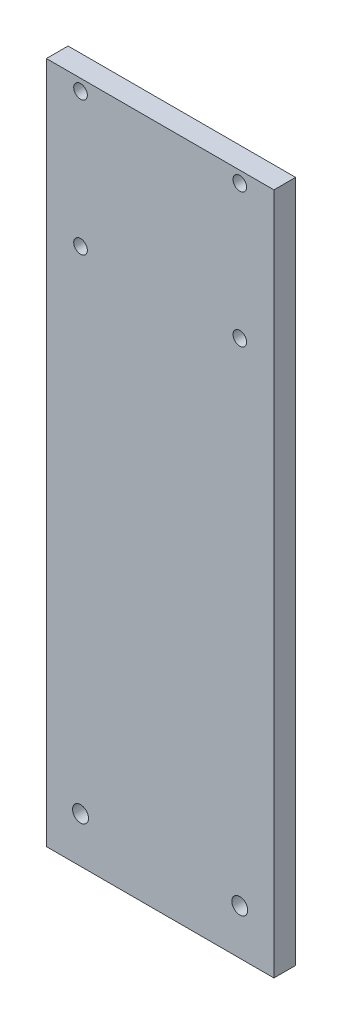
ISO-10303-21;
HEADER;
FILE_DESCRIPTION(('STEP AP214'),'2;1');
FILE_NAME('part.step','',(''),(''),'','','');
FILE_SCHEMA(('AUTOMOTIVE_DESIGN { 1 0 10303 214 1 1 1 1 }'));
ENDSEC;
DATA;
#1=APPLICATION_CONTEXT('core data for automotive mechanical design processes');
#2=APPLICATION_PROTOCOL_DEFINITION('international standard','automotive_design',2000,#1);
#3=PRODUCT_CONTEXT('',#1,'mechanical');
#4=PRODUCT('Part','Part','',(#3));
#5=PRODUCT_RELATED_PRODUCT_CATEGORY('part','',(#4));
#6=PRODUCT_DEFINITION_FORMATION('','',#4);
#7=PRODUCT_DEFINITION_CONTEXT('part definition',#1,'design');
#8=PRODUCT_DEFINITION('design','',#6,#7);
#9=PRODUCT_DEFINITION_SHAPE('','',#8);
#10=(LENGTH_UNIT() NAMED_UNIT(*) SI_UNIT(.MILLI.,.METRE.));
#11=(NAMED_UNIT(*) PLANE_ANGLE_UNIT() SI_UNIT($,.RADIAN.));
#12=(NAMED_UNIT(*) SI_UNIT($,.STERADIAN.) SOLID_ANGLE_UNIT());
#13=UNCERTAINTY_MEASURE_WITH_UNIT(LENGTH_MEASURE(1.E-05),#10,'distance_accuracy_value','');
#14=(GEOMETRIC_REPRESENTATION_CONTEXT(3) GLOBAL_UNCERTAINTY_ASSIGNED_CONTEXT((#13)) GLOBAL_UNIT_ASSIGNED_CONTEXT((#10,
#11,#12)) REPRESENTATION_CONTEXT('',''));
#15=CARTESIAN_POINT('',(0.,0.,0.));
#16=DIRECTION('',(0.,0.,1.));
#17=DIRECTION('',(1.,0.,0.));
#18=AXIS2_PLACEMENT_3D('',#15,#16,#17);
#19=CARTESIAN_POINT('',(0.,0.,9.525));
#20=DIRECTION('',(0.,0.,1.));
#21=DIRECTION('',(1.,0.,0.));
#22=AXIS2_PLACEMENT_3D('',#19,#20,#21);
#23=PLANE('',#22);
#24=CARTESIAN_POINT('',(-12.3643207575882,-166.987584244172,9.525));
#25=DIRECTION('',(0.,0.,1.));
#26=DIRECTION('',(1.,0.,0.));
#27=AXIS2_PLACEMENT_3D('',#24,#25,#26);
#28=CIRCLE('',#27,3.5);
#29=CARTESIAN_POINT('',(-15.8643207575882,-166.987584244172,9.525));
#30=VERTEX_POINT('',#29);
#31=EDGE_CURVE('E141',#30,#30,#28,.T.);
#32=ORIENTED_EDGE('',*,*,#31,.F.);
#33=EDGE_LOOP('',(#32));
#34=FACE_BOUND('',#33,.T.);
#35=CARTESIAN_POINT('',(57.6356792424118,49.0124157558282,9.525));
#36=DIRECTION('',(0.,0.,1.));
#37=DIRECTION('',(-1.,0.,0.));
#38=AXIS2_PLACEMENT_3D('',#35,#36,#37);
#39=CIRCLE('',#38,3.);
#40=CARTESIAN_POINT('',(54.6356792424118,49.0124157558282,9.525));
#41=VERTEX_POINT('',#40);
#42=EDGE_CURVE('E149',#41,#41,#39,.T.);
#43=ORIENTED_EDGE('',*,*,#42,.F.);
#44=EDGE_LOOP('',(#43));
#45=FACE_BOUND('',#44,.T.);
#46=CARTESIAN_POINT('',(-12.3643207575882,108.012415755828,9.525));
#47=DIRECTION('',(0.,0.,1.));
#48=DIRECTION('',(1.,0.,0.));
#49=AXIS2_PLACEMENT_3D('',#46,#47,#48);
#50=CIRCLE('',#49,3.);
#51=CARTESIAN_POINT('',(-15.3643207575882,108.012415755828,9.525));
#52=VERTEX_POINT('',#51);
#53=EDGE_CURVE('E99',#52,#52,#50,.T.);
#54=ORIENTED_EDGE('',*,*,#53,.F.);
#55=EDGE_LOOP('',(#54));
#56=FACE_BOUND('',#55,.T.);
#57=DIRECTION('',(0.,-1.,0.));
#58=VECTOR('',#57,1.);
#59=CARTESIAN_POINT('',(-27.3643207575882,113.012415755828,9.525));
#60=LINE('',#59,#58);
#61=CARTESIAN_POINT('',(-27.3643207575882,113.012415755828,9.525));
#62=VERTEX_POINT('',#61);
#63=CARTESIAN_POINT('',(-27.3643207575882,-186.987584244172,9.525));
#64=VERTEX_POINT('',#63);
#65=EDGE_CURVE('E78',#62,#64,#60,.T.);
#66=ORIENTED_EDGE('',*,*,#65,.T.);
#67=DIRECTION('',(1.,0.,0.));
#68=VECTOR('',#67,1.);
#69=CARTESIAN_POINT('',(-27.3643207575882,-186.987584244172,9.525));
#70=LINE('',#69,#68);
#71=CARTESIAN_POINT('',(72.6356792424119,-186.987584244172,9.525));
#72=VERTEX_POINT('',#71);
#73=EDGE_CURVE('E81',#64,#72,#70,.T.);
#74=ORIENTED_EDGE('',*,*,#73,.T.);
#75=DIRECTION('',(0.,1.,0.));
#76=VECTOR('',#75,1.);
#77=CARTESIAN_POINT('',(72.6356792424118,-131.987584244172,9.525));
#78=LINE('',#77,#76);
#79=CARTESIAN_POINT('',(72.6356792424118,113.012415755828,9.525));
#80=VERTEX_POINT('',#79);
#81=EDGE_CURVE('E85',#72,#80,#78,.T.);
#82=ORIENTED_EDGE('',*,*,#81,.T.);
#83=DIRECTION('',(-1.,0.,0.));
#84=VECTOR('',#83,1.);
#85=CARTESIAN_POINT('',(-27.3643207575882,113.012415755828,9.525));
#86=LINE('',#85,#84);
#87=EDGE_CURVE('E50',#80,#62,#86,.T.);
#88=ORIENTED_EDGE('',*,*,#87,.T.);
#89=EDGE_LOOP('',(#66,#74,#82,#88));
#90=FACE_BOUND('',#89,.T.);
#91=CARTESIAN_POINT('',(-12.3643207575882,49.0124157558282,9.525));
#92=DIRECTION('',(0.,0.,1.));
#93=DIRECTION('',(1.,0.,0.));
#94=AXIS2_PLACEMENT_3D('',#91,#92,#93);
#95=CIRCLE('',#94,3.);
#96=CARTESIAN_POINT('',(-15.3643207575882,49.0124157558282,9.525));
#97=VERTEX_POINT('',#96);
#98=EDGE_CURVE('E153',#97,#97,#95,.T.);
#99=ORIENTED_EDGE('',*,*,#98,.F.);
#100=EDGE_LOOP('',(#99));
#101=FACE_BOUND('',#100,.T.);
#102=CARTESIAN_POINT('',(57.6356792424118,108.012415755828,9.525));
#103=DIRECTION('',(0.,0.,1.));
#104=DIRECTION('',(-1.,0.,0.));
#105=AXIS2_PLACEMENT_3D('',#102,#103,#104);
#106=CIRCLE('',#105,3.);
#107=CARTESIAN_POINT('',(54.6356792424118,108.012415755828,9.525));
#108=VERTEX_POINT('',#107);
#109=EDGE_CURVE('E145',#108,#108,#106,.T.);
#110=ORIENTED_EDGE('',*,*,#109,.F.);
#111=EDGE_LOOP('',(#110));
#112=FACE_BOUND('',#111,.T.);
#113=CARTESIAN_POINT('',(57.6356792424118,-166.987584244172,9.525));
#114=DIRECTION('',(0.,0.,1.));
#115=DIRECTION('',(-1.,0.,0.));
#116=AXIS2_PLACEMENT_3D('',#113,#114,#115);
#117=CIRCLE('',#116,3.5);
#118=CARTESIAN_POINT('',(54.1356792424118,-166.987584244172,9.525));
#119=VERTEX_POINT('',#118);
#120=EDGE_CURVE('E136',#119,#119,#117,.T.);
#121=ORIENTED_EDGE('',*,*,#120,.F.);
#122=EDGE_LOOP('',(#121));
#123=FACE_BOUND('',#122,.T.);
#124=ADVANCED_FACE('F33',(#34,#45,#56,#90,#101,#112,#123),#23,.T.);
#125=CARTESIAN_POINT('',(0.,0.,0.));
#126=DIRECTION('',(0.,0.,1.));
#127=DIRECTION('',(1.,0.,0.));
#128=AXIS2_PLACEMENT_3D('',#125,#126,#127);
#129=PLANE('',#128);
#130=DIRECTION('',(0.,-1.,0.));
#131=VECTOR('',#130,1.);
#132=CARTESIAN_POINT('',(-27.3643207575882,-131.987584244172,0.));
#133=LINE('',#132,#131);
#134=CARTESIAN_POINT('',(-27.3643207575882,113.012415755828,0.));
#135=VERTEX_POINT('',#134);
#136=CARTESIAN_POINT('',(-27.3643207575882,-186.987584244172,0.));
#137=VERTEX_POINT('',#136);
#138=EDGE_CURVE('E73',#135,#137,#133,.T.);
#139=ORIENTED_EDGE('',*,*,#138,.F.);
#140=DIRECTION('',(-1.,0.,0.));
#141=VECTOR('',#140,1.);
#142=CARTESIAN_POINT('',(-27.3643207575882,113.012415755828,0.));
#143=LINE('',#142,#141);
#144=CARTESIAN_POINT('',(72.6356792424118,113.012415755828,0.));
#145=VERTEX_POINT('',#144);
#146=EDGE_CURVE('E102',#145,#135,#143,.T.);
#147=ORIENTED_EDGE('',*,*,#146,.F.);
#148=DIRECTION('',(0.,1.,0.));
#149=VECTOR('',#148,1.);
#150=CARTESIAN_POINT('',(72.6356792424118,113.012415755828,0.));
#151=LINE('',#150,#149);
#152=CARTESIAN_POINT('',(72.6356792424119,-186.987584244172,0.));
#153=VERTEX_POINT('',#152);
#154=EDGE_CURVE('E66',#153,#145,#151,.T.);
#155=ORIENTED_EDGE('',*,*,#154,.F.);
#156=DIRECTION('',(1.,0.,0.));
#157=VECTOR('',#156,1.);
#158=CARTESIAN_POINT('',(-27.3643207575882,-186.987584244172,0.));
#159=LINE('',#158,#157);
#160=EDGE_CURVE('E90',#137,#153,#159,.T.);
#161=ORIENTED_EDGE('',*,*,#160,.F.);
#162=EDGE_LOOP('',(#139,#147,#155,#161));
#163=FACE_BOUND('',#162,.T.);
#164=CARTESIAN_POINT('',(-12.3643207575882,108.012415755828,0.));
#165=DIRECTION('',(0.,0.,1.));
#166=DIRECTION('',(1.,0.,0.));
#167=AXIS2_PLACEMENT_3D('',#164,#165,#166);
#168=CIRCLE('',#167,3.);
#169=CARTESIAN_POINT('',(-15.3643207575882,108.012415755828,0.));
#170=VERTEX_POINT('',#169);
#171=EDGE_CURVE('E115',#170,#170,#168,.T.);
#172=ORIENTED_EDGE('',*,*,#171,.T.);
#173=EDGE_LOOP('',(#172));
#174=FACE_BOUND('',#173,.T.);
#175=CARTESIAN_POINT('',(-12.3643207575882,49.0124157558282,0.));
#176=DIRECTION('',(0.,0.,1.));
#177=DIRECTION('',(1.,0.,0.));
#178=AXIS2_PLACEMENT_3D('',#175,#176,#177);
#179=CIRCLE('',#178,3.);
#180=CARTESIAN_POINT('',(-15.3643207575882,49.0124157558282,0.));
#181=VERTEX_POINT('',#180);
#182=EDGE_CURVE('E119',#181,#181,#179,.T.);
#183=ORIENTED_EDGE('',*,*,#182,.T.);
#184=EDGE_LOOP('',(#183));
#185=FACE_BOUND('',#184,.T.);
#186=CARTESIAN_POINT('',(57.6356792424118,49.0124157558282,0.));
#187=DIRECTION('',(0.,0.,1.));
#188=DIRECTION('',(-1.,0.,0.));
#189=AXIS2_PLACEMENT_3D('',#186,#187,#188);
#190=CIRCLE('',#189,3.);
#191=CARTESIAN_POINT('',(54.6356792424118,49.0124157558282,0.));
#192=VERTEX_POINT('',#191);
#193=EDGE_CURVE('E123',#192,#192,#190,.T.);
#194=ORIENTED_EDGE('',*,*,#193,.T.);
#195=EDGE_LOOP('',(#194));
#196=FACE_BOUND('',#195,.T.);
#197=CARTESIAN_POINT('',(57.6356792424118,108.012415755828,0.));
#198=DIRECTION('',(0.,0.,1.));
#199=DIRECTION('',(-1.,0.,0.));
#200=AXIS2_PLACEMENT_3D('',#197,#198,#199);
#201=CIRCLE('',#200,3.);
#202=CARTESIAN_POINT('',(54.6356792424118,108.012415755828,0.));
#203=VERTEX_POINT('',#202);
#204=EDGE_CURVE('E127',#203,#203,#201,.T.);
#205=ORIENTED_EDGE('',*,*,#204,.T.);
#206=EDGE_LOOP('',(#205));
#207=FACE_BOUND('',#206,.T.);
#208=CARTESIAN_POINT('',(-12.3643207575882,-166.987584244172,0.));
#209=DIRECTION('',(0.,0.,1.));
#210=DIRECTION('',(1.,0.,0.));
#211=AXIS2_PLACEMENT_3D('',#208,#209,#210);
#212=CIRCLE('',#211,3.5);
#213=CARTESIAN_POINT('',(-15.8643207575882,-166.987584244172,0.));
#214=VERTEX_POINT('',#213);
#215=EDGE_CURVE('E131',#214,#214,#212,.T.);
#216=ORIENTED_EDGE('',*,*,#215,.T.);
#217=EDGE_LOOP('',(#216));
#218=FACE_BOUND('',#217,.T.);
#219=CARTESIAN_POINT('',(57.6356792424118,-166.987584244172,0.));
#220=DIRECTION('',(0.,0.,1.));
#221=DIRECTION('',(-1.,0.,0.));
#222=AXIS2_PLACEMENT_3D('',#219,#220,#221);
#223=CIRCLE('',#222,3.5);
#224=CARTESIAN_POINT('',(54.1356792424118,-166.987584244172,0.));
#225=VERTEX_POINT('',#224);
#226=EDGE_CURVE('E134',#225,#225,#223,.T.);
#227=ORIENTED_EDGE('',*,*,#226,.T.);
#228=EDGE_LOOP('',(#227));
#229=FACE_BOUND('',#228,.T.);
#230=ADVANCED_FACE('F108',(#163,#174,#185,#196,#207,#218,#229),#129,.F.);
#231=CARTESIAN_POINT('',(-27.3643207575882,-131.987584244172,9.525));
#232=DIRECTION('',(1.,0.,0.));
#233=DIRECTION('',(0.,1.,0.));
#234=AXIS2_PLACEMENT_3D('',#231,#232,#233);
#235=PLANE('',#234);
#236=ORIENTED_EDGE('',*,*,#138,.T.);
#237=DIRECTION('',(0.,0.,-1.));
#238=VECTOR('',#237,1.);
#239=CARTESIAN_POINT('',(-27.3643207575882,-186.987584244172,9.525));
#240=LINE('',#239,#238);
#241=EDGE_CURVE('E11',#64,#137,#240,.T.);
#242=ORIENTED_EDGE('',*,*,#241,.F.);
#243=ORIENTED_EDGE('',*,*,#65,.F.);
#244=DIRECTION('',(0.,0.,-1.));
#245=VECTOR('',#244,1.);
#246=CARTESIAN_POINT('',(-27.3643207575882,113.012415755828,9.525));
#247=LINE('',#246,#245);
#248=EDGE_CURVE('E94',#62,#135,#247,.T.);
#249=ORIENTED_EDGE('',*,*,#248,.T.);
#250=EDGE_LOOP('',(#236,#242,#243,#249));
#251=FACE_BOUND('',#250,.T.);
#252=ADVANCED_FACE('F35',(#251),#235,.F.);
#253=CARTESIAN_POINT('',(-27.3643207575882,-186.987584244172,9.525));
#254=DIRECTION('',(0.,1.,0.));
#255=DIRECTION('',(0.,0.,1.));
#256=AXIS2_PLACEMENT_3D('',#253,#254,#255);
#257=PLANE('',#256);
#258=ORIENTED_EDGE('',*,*,#160,.T.);
#259=DIRECTION('',(0.,0.,-1.));
#260=VECTOR('',#259,1.);
#261=CARTESIAN_POINT('',(72.6356792424119,-186.987584244172,9.525));
#262=LINE('',#261,#260);
#263=EDGE_CURVE('E42',#72,#153,#262,.T.);
#264=ORIENTED_EDGE('',*,*,#263,.F.);
#265=ORIENTED_EDGE('',*,*,#73,.F.);
#266=ORIENTED_EDGE('',*,*,#241,.T.);
#267=EDGE_LOOP('',(#258,#264,#265,#266));
#268=FACE_BOUND('',#267,.T.);
#269=ADVANCED_FACE('F89',(#268),#257,.F.);
#270=CARTESIAN_POINT('',(72.6356792424118,113.012415755828,9.525));
#271=DIRECTION('',(-1.,0.,0.));
#272=DIRECTION('',(0.,-1.,0.));
#273=AXIS2_PLACEMENT_3D('',#270,#271,#272);
#274=PLANE('',#273);
#275=ORIENTED_EDGE('',*,*,#154,.T.);
#276=DIRECTION('',(0.,0.,-1.));
#277=VECTOR('',#276,1.);
#278=CARTESIAN_POINT('',(72.6356792424118,113.012415755828,9.525));
#279=LINE('',#278,#277);
#280=EDGE_CURVE('E91',#80,#145,#279,.T.);
#281=ORIENTED_EDGE('',*,*,#280,.F.);
#282=ORIENTED_EDGE('',*,*,#81,.F.);
#283=ORIENTED_EDGE('',*,*,#263,.T.);
#284=EDGE_LOOP('',(#275,#281,#282,#283));
#285=FACE_BOUND('',#284,.T.);
#286=ADVANCED_FACE('F92',(#285),#274,.F.);
#287=CARTESIAN_POINT('',(-27.3643207575882,113.012415755828,9.525));
#288=DIRECTION('',(0.,-1.,0.));
#289=DIRECTION('',(1.,0.,0.));
#290=AXIS2_PLACEMENT_3D('',#287,#288,#289);
#291=PLANE('',#290);
#292=ORIENTED_EDGE('',*,*,#146,.T.);
#293=ORIENTED_EDGE('',*,*,#248,.F.);
#294=ORIENTED_EDGE('',*,*,#87,.F.);
#295=ORIENTED_EDGE('',*,*,#280,.T.);
#296=EDGE_LOOP('',(#292,#293,#294,#295));
#297=FACE_BOUND('',#296,.T.);
#298=ADVANCED_FACE('F107',(#297),#291,.F.);
#299=CARTESIAN_POINT('',(-12.3643207575882,108.012415755828,9.525));
#300=DIRECTION('',(0.,0.,-1.));
#301=DIRECTION('',(-1.,0.,0.));
#302=AXIS2_PLACEMENT_3D('',#299,#300,#301);
#303=CYLINDRICAL_SURFACE('',#302,3.);
#304=CARTESIAN_POINT('',(-15.3643207575882,108.012415755828,9.525));
#305=CARTESIAN_POINT('',(-15.3643207575882,108.012415755828,9.42578125));
#306=CARTESIAN_POINT('',(-15.3643207575882,108.012415755828,9.3265625));
#307=CARTESIAN_POINT('',(-15.3643207575882,108.012415755828,9.128125));
#308=CARTESIAN_POINT('',(-15.3643207575882,108.012415755828,9.02890625));
#309=CARTESIAN_POINT('',(-15.3643207575882,108.012415755828,8.83046875));
#310=CARTESIAN_POINT('',(-15.3643207575882,108.012415755828,8.73125));
#311=CARTESIAN_POINT('',(-15.3643207575882,108.012415755828,8.5328125));
#312=CARTESIAN_POINT('',(-15.3643207575882,108.012415755828,8.43359375));
#313=CARTESIAN_POINT('',(-15.3643207575882,108.012415755828,8.23515625));
#314=CARTESIAN_POINT('',(-15.3643207575882,108.012415755828,8.1359375));
#315=CARTESIAN_POINT('',(-15.3643207575882,108.012415755828,7.9375));
#316=CARTESIAN_POINT('',(-15.3643207575882,108.012415755828,7.83828125));
#317=CARTESIAN_POINT('',(-15.3643207575882,108.012415755828,7.63984375));
#318=CARTESIAN_POINT('',(-15.3643207575882,108.012415755828,7.540625));
#319=CARTESIAN_POINT('',(-15.3643207575882,108.012415755828,7.3421875));
#320=CARTESIAN_POINT('',(-15.3643207575882,108.012415755828,7.24296875));
#321=CARTESIAN_POINT('',(-15.3643207575882,108.012415755828,7.04453125));
#322=CARTESIAN_POINT('',(-15.3643207575882,108.012415755828,6.9453125));
#323=CARTESIAN_POINT('',(-15.3643207575882,108.012415755828,6.746875));
#324=CARTESIAN_POINT('',(-15.3643207575882,108.012415755828,6.64765625));
#325=CARTESIAN_POINT('',(-15.3643207575882,108.012415755828,6.44921875));
#326=CARTESIAN_POINT('',(-15.3643207575882,108.012415755828,6.35));
#327=CARTESIAN_POINT('',(-15.3643207575882,108.012415755828,6.1515625));
#328=CARTESIAN_POINT('',(-15.3643207575882,108.012415755828,6.05234375));
#329=CARTESIAN_POINT('',(-15.3643207575882,108.012415755828,5.85390625));
#330=CARTESIAN_POINT('',(-15.3643207575882,108.012415755828,5.7546875));
#331=CARTESIAN_POINT('',(-15.3643207575882,108.012415755828,5.55625));
#332=CARTESIAN_POINT('',(-15.3643207575882,108.012415755828,5.45703125));
#333=CARTESIAN_POINT('',(-15.3643207575882,108.012415755828,5.25859375));
#334=CARTESIAN_POINT('',(-15.3643207575882,108.012415755828,5.159375));
#335=CARTESIAN_POINT('',(-15.3643207575882,108.012415755828,4.9609375));
#336=CARTESIAN_POINT('',(-15.3643207575882,108.012415755828,4.86171875));
#337=CARTESIAN_POINT('',(-15.3643207575882,108.012415755828,4.66328125));
#338=CARTESIAN_POINT('',(-15.3643207575882,108.012415755828,4.5640625));
#339=CARTESIAN_POINT('',(-15.3643207575882,108.012415755828,4.365625));
#340=CARTESIAN_POINT('',(-15.3643207575882,108.012415755828,4.26640625));
#341=CARTESIAN_POINT('',(-15.3643207575882,108.012415755828,4.06796875));
#342=CARTESIAN_POINT('',(-15.3643207575882,108.012415755828,3.96875));
#343=CARTESIAN_POINT('',(-15.3643207575882,108.012415755828,3.7703125));
#344=CARTESIAN_POINT('',(-15.3643207575882,108.012415755828,3.67109375));
#345=CARTESIAN_POINT('',(-15.3643207575882,108.012415755828,3.47265625));
#346=CARTESIAN_POINT('',(-15.3643207575882,108.012415755828,3.3734375));
#347=CARTESIAN_POINT('',(-15.3643207575882,108.012415755828,3.175));
#348=CARTESIAN_POINT('',(-15.3643207575882,108.012415755828,3.07578125));
#349=CARTESIAN_POINT('',(-15.3643207575882,108.012415755828,2.87734375));
#350=CARTESIAN_POINT('',(-15.3643207575882,108.012415755828,2.778125));
#351=CARTESIAN_POINT('',(-15.3643207575882,108.012415755828,2.5796875));
#352=CARTESIAN_POINT('',(-15.3643207575882,108.012415755828,2.48046875));
#353=CARTESIAN_POINT('',(-15.3643207575882,108.012415755828,2.28203125));
#354=CARTESIAN_POINT('',(-15.3643207575882,108.012415755828,2.1828125));
#355=CARTESIAN_POINT('',(-15.3643207575882,108.012415755828,1.984375));
#356=CARTESIAN_POINT('',(-15.3643207575882,108.012415755828,1.88515625));
#357=CARTESIAN_POINT('',(-15.3643207575882,108.012415755828,1.68671875));
#358=CARTESIAN_POINT('',(-15.3643207575882,108.012415755828,1.5875));
#359=CARTESIAN_POINT('',(-15.3643207575882,108.012415755828,1.3890625));
#360=CARTESIAN_POINT('',(-15.3643207575882,108.012415755828,1.28984375));
#361=CARTESIAN_POINT('',(-15.3643207575882,108.012415755828,1.09140625));
#362=CARTESIAN_POINT('',(-15.3643207575882,108.012415755828,0.992187500000001));
#363=CARTESIAN_POINT('',(-15.3643207575882,108.012415755828,0.793750000000001));
#364=CARTESIAN_POINT('',(-15.3643207575882,108.012415755828,0.69453125));
#365=CARTESIAN_POINT('',(-15.3643207575882,108.012415755828,0.49609375));
#366=CARTESIAN_POINT('',(-15.3643207575882,108.012415755828,0.396875));
#367=CARTESIAN_POINT('',(-15.3643207575882,108.012415755828,0.1984375));
#368=CARTESIAN_POINT('',(-15.3643207575882,108.012415755828,0.0992187500000001));
#369=CARTESIAN_POINT('',(-15.3643207575882,108.012415755828,0.));
#370=B_SPLINE_CURVE_WITH_KNOTS('',3,(#304,#305,#306,#307,#308,#309,#310,#311,#312,#313,#314,
#315,#316,#317,#318,#319,#320,#321,#322,#323,#324,#325,#326,#327,#328,#329,#330,#331,#332,#333,
#334,#335,#336,#337,#338,#339,#340,#341,#342,#343,#344,#345,#346,#347,#348,#349,#350,#351,#352,
#353,#354,#355,#356,#357,#358,#359,#360,#361,#362,#363,#364,#365,#366,#367,#368,#369),
.UNSPECIFIED.,.F.,.F.,(4,2,2,2,2,2,2,2,2,2,2,2,2,2,2,2,2,2,2,2,2,2,2,2,2,2,2,2,2,2,2,2,4),(0.,
0.297656249999998,0.595312499999999,0.892968749999999,1.190625,1.48828125,1.7859375,2.08359375,
2.38125,2.67890625,2.9765625,3.27421875,3.571875,3.86953125,4.1671875,4.46484375,4.7625,
5.06015625,5.3578125,5.65546875,5.953125,6.25078125,6.5484375,6.84609375,7.14375,7.44140625,
7.7390625,8.03671875,8.334375,8.63203125,8.9296875,9.22734375,9.525),.UNSPECIFIED.);
#371=EDGE_CURVE('BSEAM161',#52,#170,#370,.T.);
#372=ORIENTED_EDGE('',*,*,#53,.T.);
#373=ORIENTED_EDGE('',*,*,#171,.F.);
#374=ORIENTED_EDGE('',*,*,#371,.T.);
#375=ORIENTED_EDGE('',*,*,#371,.F.);
#376=EDGE_LOOP('',(#372,#374,#373,#375));
#377=FACE_BOUND('',#376,.T.);
#378=ADVANCED_FACE('F161',(#377),#303,.F.);
#379=CARTESIAN_POINT('',(-12.3643207575882,49.0124157558282,9.525));
#380=DIRECTION('',(0.,0.,-1.));
#381=DIRECTION('',(-1.,0.,0.));
#382=AXIS2_PLACEMENT_3D('',#379,#380,#381);
#383=CYLINDRICAL_SURFACE('',#382,3.);
#384=CARTESIAN_POINT('',(-15.3643207575882,49.0124157558282,9.525));
#385=CARTESIAN_POINT('',(-15.3643207575882,49.0124157558282,9.42578125));
#386=CARTESIAN_POINT('',(-15.3643207575882,49.0124157558282,9.3265625));
#387=CARTESIAN_POINT('',(-15.3643207575882,49.0124157558282,9.128125));
#388=CARTESIAN_POINT('',(-15.3643207575882,49.0124157558282,9.02890625));
#389=CARTESIAN_POINT('',(-15.3643207575882,49.0124157558282,8.83046875));
#390=CARTESIAN_POINT('',(-15.3643207575882,49.0124157558282,8.73125));
#391=CARTESIAN_POINT('',(-15.3643207575882,49.0124157558282,8.5328125));
#392=CARTESIAN_POINT('',(-15.3643207575882,49.0124157558282,8.43359375));
#393=CARTESIAN_POINT('',(-15.3643207575882,49.0124157558282,8.23515625));
#394=CARTESIAN_POINT('',(-15.3643207575882,49.0124157558282,8.1359375));
#395=CARTESIAN_POINT('',(-15.3643207575882,49.0124157558282,7.9375));
#396=CARTESIAN_POINT('',(-15.3643207575882,49.0124157558282,7.83828125));
#397=CARTESIAN_POINT('',(-15.3643207575882,49.0124157558282,7.63984375));
#398=CARTESIAN_POINT('',(-15.3643207575882,49.0124157558282,7.540625));
#399=CARTESIAN_POINT('',(-15.3643207575882,49.0124157558282,7.3421875));
#400=CARTESIAN_POINT('',(-15.3643207575882,49.0124157558282,7.24296875));
#401=CARTESIAN_POINT('',(-15.3643207575882,49.0124157558282,7.04453125));
#402=CARTESIAN_POINT('',(-15.3643207575882,49.0124157558282,6.9453125));
#403=CARTESIAN_POINT('',(-15.3643207575882,49.0124157558282,6.746875));
#404=CARTESIAN_POINT('',(-15.3643207575882,49.0124157558282,6.64765625));
#405=CARTESIAN_POINT('',(-15.3643207575882,49.0124157558282,6.44921875));
#406=CARTESIAN_POINT('',(-15.3643207575882,49.0124157558282,6.35));
#407=CARTESIAN_POINT('',(-15.3643207575882,49.0124157558282,6.1515625));
#408=CARTESIAN_POINT('',(-15.3643207575882,49.0124157558282,6.05234375));
#409=CARTESIAN_POINT('',(-15.3643207575882,49.0124157558282,5.85390625));
#410=CARTESIAN_POINT('',(-15.3643207575882,49.0124157558282,5.7546875));
#411=CARTESIAN_POINT('',(-15.3643207575882,49.0124157558282,5.55625));
#412=CARTESIAN_POINT('',(-15.3643207575882,49.0124157558282,5.45703125));
#413=CARTESIAN_POINT('',(-15.3643207575882,49.0124157558282,5.25859375));
#414=CARTESIAN_POINT('',(-15.3643207575882,49.0124157558282,5.159375));
#415=CARTESIAN_POINT('',(-15.3643207575882,49.0124157558282,4.9609375));
#416=CARTESIAN_POINT('',(-15.3643207575882,49.0124157558282,4.86171875));
#417=CARTESIAN_POINT('',(-15.3643207575882,49.0124157558282,4.66328125));
#418=CARTESIAN_POINT('',(-15.3643207575882,49.0124157558282,4.5640625));
#419=CARTESIAN_POINT('',(-15.3643207575882,49.0124157558282,4.365625));
#420=CARTESIAN_POINT('',(-15.3643207575882,49.0124157558282,4.26640625));
#421=CARTESIAN_POINT('',(-15.3643207575882,49.0124157558282,4.06796875));
#422=CARTESIAN_POINT('',(-15.3643207575882,49.0124157558282,3.96875));
#423=CARTESIAN_POINT('',(-15.3643207575882,49.0124157558282,3.7703125));
#424=CARTESIAN_POINT('',(-15.3643207575882,49.0124157558282,3.67109375));
#425=CARTESIAN_POINT('',(-15.3643207575882,49.0124157558282,3.47265625));
#426=CARTESIAN_POINT('',(-15.3643207575882,49.0124157558282,3.3734375));
#427=CARTESIAN_POINT('',(-15.3643207575882,49.0124157558282,3.175));
#428=CARTESIAN_POINT('',(-15.3643207575882,49.0124157558282,3.07578125));
#429=CARTESIAN_POINT('',(-15.3643207575882,49.0124157558282,2.87734375));
#430=CARTESIAN_POINT('',(-15.3643207575882,49.0124157558282,2.778125));
#431=CARTESIAN_POINT('',(-15.3643207575882,49.0124157558282,2.5796875));
#432=CARTESIAN_POINT('',(-15.3643207575882,49.0124157558282,2.48046875));
#433=CARTESIAN_POINT('',(-15.3643207575882,49.0124157558282,2.28203125));
#434=CARTESIAN_POINT('',(-15.3643207575882,49.0124157558282,2.1828125));
#435=CARTESIAN_POINT('',(-15.3643207575882,49.0124157558282,1.984375));
#436=CARTESIAN_POINT('',(-15.3643207575882,49.0124157558282,1.88515625));
#437=CARTESIAN_POINT('',(-15.3643207575882,49.0124157558282,1.68671875));
#438=CARTESIAN_POINT('',(-15.3643207575882,49.0124157558282,1.5875));
#439=CARTESIAN_POINT('',(-15.3643207575882,49.0124157558282,1.3890625));
#440=CARTESIAN_POINT('',(-15.3643207575882,49.0124157558282,1.28984375));
#441=CARTESIAN_POINT('',(-15.3643207575882,49.0124157558282,1.09140625));
#442=CARTESIAN_POINT('',(-15.3643207575882,49.0124157558282,0.992187500000001));
#443=CARTESIAN_POINT('',(-15.3643207575882,49.0124157558282,0.793750000000001));
#444=CARTESIAN_POINT('',(-15.3643207575882,49.0124157558282,0.69453125));
#445=CARTESIAN_POINT('',(-15.3643207575882,49.0124157558282,0.49609375));
#446=CARTESIAN_POINT('',(-15.3643207575882,49.0124157558282,0.396875));
#447=CARTESIAN_POINT('',(-15.3643207575882,49.0124157558282,0.1984375));
#448=CARTESIAN_POINT('',(-15.3643207575882,49.0124157558282,0.0992187500000001));
#449=CARTESIAN_POINT('',(-15.3643207575882,49.0124157558282,0.));
#450=B_SPLINE_CURVE_WITH_KNOTS('',3,(#384,#385,#386,#387,#388,#389,#390,#391,#392,#393,#394,
#395,#396,#397,#398,#399,#400,#401,#402,#403,#404,#405,#406,#407,#408,#409,#410,#411,#412,#413,
#414,#415,#416,#417,#418,#419,#420,#421,#422,#423,#424,#425,#426,#427,#428,#429,#430,#431,#432,
#433,#434,#435,#436,#437,#438,#439,#440,#441,#442,#443,#444,#445,#446,#447,#448,#449),
.UNSPECIFIED.,.F.,.F.,(4,2,2,2,2,2,2,2,2,2,2,2,2,2,2,2,2,2,2,2,2,2,2,2,2,2,2,2,2,2,2,2,4),(0.,
0.297656249999998,0.595312499999999,0.892968749999999,1.190625,1.48828125,1.7859375,2.08359375,
2.38125,2.67890625,2.9765625,3.27421875,3.571875,3.86953125,4.1671875,4.46484375,4.7625,
5.06015625,5.3578125,5.65546875,5.953125,6.25078125,6.5484375,6.84609375,7.14375,7.44140625,
7.7390625,8.03671875,8.334375,8.63203125,8.9296875,9.22734375,9.525),.UNSPECIFIED.);
#451=EDGE_CURVE('BSEAM230',#97,#181,#450,.T.);
#452=ORIENTED_EDGE('',*,*,#98,.T.);
#453=ORIENTED_EDGE('',*,*,#182,.F.);
#454=ORIENTED_EDGE('',*,*,#451,.T.);
#455=ORIENTED_EDGE('',*,*,#451,.F.);
#456=EDGE_LOOP('',(#452,#454,#453,#455));
#457=FACE_BOUND('',#456,.T.);
#458=ADVANCED_FACE('F230',(#457),#383,.F.);
#459=CARTESIAN_POINT('',(57.6356792424118,49.0124157558282,9.525));
#460=DIRECTION('',(0.,0.,-1.));
#461=DIRECTION('',(-1.,0.,0.));
#462=AXIS2_PLACEMENT_3D('',#459,#460,#461);
#463=CYLINDRICAL_SURFACE('',#462,3.);
#464=CARTESIAN_POINT('',(54.6356792424118,49.0124157558282,9.525));
#465=CARTESIAN_POINT('',(54.6356792424118,49.0124157558282,9.42578125));
#466=CARTESIAN_POINT('',(54.6356792424118,49.0124157558282,9.3265625));
#467=CARTESIAN_POINT('',(54.6356792424118,49.0124157558282,9.128125));
#468=CARTESIAN_POINT('',(54.6356792424118,49.0124157558282,9.02890625));
#469=CARTESIAN_POINT('',(54.6356792424118,49.0124157558282,8.83046875));
#470=CARTESIAN_POINT('',(54.6356792424118,49.0124157558282,8.73125));
#471=CARTESIAN_POINT('',(54.6356792424118,49.0124157558282,8.5328125));
#472=CARTESIAN_POINT('',(54.6356792424118,49.0124157558282,8.43359375));
#473=CARTESIAN_POINT('',(54.6356792424118,49.0124157558282,8.23515625));
#474=CARTESIAN_POINT('',(54.6356792424118,49.0124157558282,8.1359375));
#475=CARTESIAN_POINT('',(54.6356792424118,49.0124157558282,7.9375));
#476=CARTESIAN_POINT('',(54.6356792424118,49.0124157558282,7.83828125));
#477=CARTESIAN_POINT('',(54.6356792424118,49.0124157558282,7.63984375));
#478=CARTESIAN_POINT('',(54.6356792424118,49.0124157558282,7.540625));
#479=CARTESIAN_POINT('',(54.6356792424118,49.0124157558282,7.3421875));
#480=CARTESIAN_POINT('',(54.6356792424118,49.0124157558282,7.24296875));
#481=CARTESIAN_POINT('',(54.6356792424118,49.0124157558282,7.04453125));
#482=CARTESIAN_POINT('',(54.6356792424118,49.0124157558282,6.9453125));
#483=CARTESIAN_POINT('',(54.6356792424118,49.0124157558282,6.746875));
#484=CARTESIAN_POINT('',(54.6356792424118,49.0124157558282,6.64765625));
#485=CARTESIAN_POINT('',(54.6356792424118,49.0124157558282,6.44921875));
#486=CARTESIAN_POINT('',(54.6356792424118,49.0124157558282,6.35));
#487=CARTESIAN_POINT('',(54.6356792424118,49.0124157558282,6.1515625));
#488=CARTESIAN_POINT('',(54.6356792424118,49.0124157558282,6.05234375));
#489=CARTESIAN_POINT('',(54.6356792424118,49.0124157558282,5.85390625));
#490=CARTESIAN_POINT('',(54.6356792424118,49.0124157558282,5.7546875));
#491=CARTESIAN_POINT('',(54.6356792424118,49.0124157558282,5.55625));
#492=CARTESIAN_POINT('',(54.6356792424118,49.0124157558282,5.45703125));
#493=CARTESIAN_POINT('',(54.6356792424118,49.0124157558282,5.25859375));
#494=CARTESIAN_POINT('',(54.6356792424118,49.0124157558282,5.159375));
#495=CARTESIAN_POINT('',(54.6356792424118,49.0124157558282,4.9609375));
#496=CARTESIAN_POINT('',(54.6356792424118,49.0124157558282,4.86171875));
#497=CARTESIAN_POINT('',(54.6356792424118,49.0124157558282,4.66328125));
#498=CARTESIAN_POINT('',(54.6356792424118,49.0124157558282,4.5640625));
#499=CARTESIAN_POINT('',(54.6356792424118,49.0124157558282,4.365625));
#500=CARTESIAN_POINT('',(54.6356792424118,49.0124157558282,4.26640625));
#501=CARTESIAN_POINT('',(54.6356792424118,49.0124157558282,4.06796875));
#502=CARTESIAN_POINT('',(54.6356792424118,49.0124157558282,3.96875));
#503=CARTESIAN_POINT('',(54.6356792424118,49.0124157558282,3.7703125));
#504=CARTESIAN_POINT('',(54.6356792424118,49.0124157558282,3.67109375));
#505=CARTESIAN_POINT('',(54.6356792424118,49.0124157558282,3.47265625));
#506=CARTESIAN_POINT('',(54.6356792424118,49.0124157558282,3.3734375));
#507=CARTESIAN_POINT('',(54.6356792424118,49.0124157558282,3.175));
#508=CARTESIAN_POINT('',(54.6356792424118,49.0124157558282,3.07578125));
#509=CARTESIAN_POINT('',(54.6356792424118,49.0124157558282,2.87734375));
#510=CARTESIAN_POINT('',(54.6356792424118,49.0124157558282,2.778125));
#511=CARTESIAN_POINT('',(54.6356792424118,49.0124157558282,2.5796875));
#512=CARTESIAN_POINT('',(54.6356792424118,49.0124157558282,2.48046875));
#513=CARTESIAN_POINT('',(54.6356792424118,49.0124157558282,2.28203125));
#514=CARTESIAN_POINT('',(54.6356792424118,49.0124157558282,2.1828125));
#515=CARTESIAN_POINT('',(54.6356792424118,49.0124157558282,1.984375));
#516=CARTESIAN_POINT('',(54.6356792424118,49.0124157558282,1.88515625));
#517=CARTESIAN_POINT('',(54.6356792424118,49.0124157558282,1.68671875));
#518=CARTESIAN_POINT('',(54.6356792424118,49.0124157558282,1.5875));
#519=CARTESIAN_POINT('',(54.6356792424118,49.0124157558282,1.3890625));
#520=CARTESIAN_POINT('',(54.6356792424118,49.0124157558282,1.28984375));
#521=CARTESIAN_POINT('',(54.6356792424118,49.0124157558282,1.09140625));
#522=CARTESIAN_POINT('',(54.6356792424118,49.0124157558282,0.992187500000001));
#523=CARTESIAN_POINT('',(54.6356792424118,49.0124157558282,0.793750000000001));
#524=CARTESIAN_POINT('',(54.6356792424118,49.0124157558282,0.69453125));
#525=CARTESIAN_POINT('',(54.6356792424118,49.0124157558282,0.49609375));
#526=CARTESIAN_POINT('',(54.6356792424118,49.0124157558282,0.396875));
#527=CARTESIAN_POINT('',(54.6356792424118,49.0124157558282,0.1984375));
#528=CARTESIAN_POINT('',(54.6356792424118,49.0124157558282,0.0992187500000001));
#529=CARTESIAN_POINT('',(54.6356792424118,49.0124157558282,0.));
#530=B_SPLINE_CURVE_WITH_KNOTS('',3,(#464,#465,#466,#467,#468,#469,#470,#471,#472,#473,#474,
#475,#476,#477,#478,#479,#480,#481,#482,#483,#484,#485,#486,#487,#488,#489,#490,#491,#492,#493,
#494,#495,#496,#497,#498,#499,#500,#501,#502,#503,#504,#505,#506,#507,#508,#509,#510,#511,#512,
#513,#514,#515,#516,#517,#518,#519,#520,#521,#522,#523,#524,#525,#526,#527,#528,#529),
.UNSPECIFIED.,.F.,.F.,(4,2,2,2,2,2,2,2,2,2,2,2,2,2,2,2,2,2,2,2,2,2,2,2,2,2,2,2,2,2,2,2,4),(0.,
0.297656249999998,0.595312499999999,0.892968749999999,1.190625,1.48828125,1.7859375,2.08359375,
2.38125,2.67890625,2.9765625,3.27421875,3.571875,3.86953125,4.1671875,4.46484375,4.7625,
5.06015625,5.3578125,5.65546875,5.953125,6.25078125,6.5484375,6.84609375,7.14375,7.44140625,
7.7390625,8.03671875,8.334375,8.63203125,8.9296875,9.22734375,9.525),.UNSPECIFIED.);
#531=EDGE_CURVE('BSEAM237',#41,#192,#530,.T.);
#532=ORIENTED_EDGE('',*,*,#42,.T.);
#533=ORIENTED_EDGE('',*,*,#193,.F.);
#534=ORIENTED_EDGE('',*,*,#531,.T.);
#535=ORIENTED_EDGE('',*,*,#531,.F.);
#536=EDGE_LOOP('',(#532,#534,#533,#535));
#537=FACE_BOUND('',#536,.T.);
#538=ADVANCED_FACE('F237',(#537),#463,.F.);
#539=CARTESIAN_POINT('',(57.6356792424118,108.012415755828,9.525));
#540=DIRECTION('',(0.,0.,-1.));
#541=DIRECTION('',(-1.,0.,0.));
#542=AXIS2_PLACEMENT_3D('',#539,#540,#541);
#543=CYLINDRICAL_SURFACE('',#542,3.);
#544=CARTESIAN_POINT('',(54.6356792424118,108.012415755828,9.525));
#545=CARTESIAN_POINT('',(54.6356792424118,108.012415755828,9.42578125));
#546=CARTESIAN_POINT('',(54.6356792424118,108.012415755828,9.3265625));
#547=CARTESIAN_POINT('',(54.6356792424118,108.012415755828,9.128125));
#548=CARTESIAN_POINT('',(54.6356792424118,108.012415755828,9.02890625));
#549=CARTESIAN_POINT('',(54.6356792424118,108.012415755828,8.83046875));
#550=CARTESIAN_POINT('',(54.6356792424118,108.012415755828,8.73125));
#551=CARTESIAN_POINT('',(54.6356792424118,108.012415755828,8.5328125));
#552=CARTESIAN_POINT('',(54.6356792424118,108.012415755828,8.43359375));
#553=CARTESIAN_POINT('',(54.6356792424118,108.012415755828,8.23515625));
#554=CARTESIAN_POINT('',(54.6356792424118,108.012415755828,8.1359375));
#555=CARTESIAN_POINT('',(54.6356792424118,108.012415755828,7.9375));
#556=CARTESIAN_POINT('',(54.6356792424118,108.012415755828,7.83828125));
#557=CARTESIAN_POINT('',(54.6356792424118,108.012415755828,7.63984375));
#558=CARTESIAN_POINT('',(54.6356792424118,108.012415755828,7.540625));
#559=CARTESIAN_POINT('',(54.6356792424118,108.012415755828,7.3421875));
#560=CARTESIAN_POINT('',(54.6356792424118,108.012415755828,7.24296875));
#561=CARTESIAN_POINT('',(54.6356792424118,108.012415755828,7.04453125));
#562=CARTESIAN_POINT('',(54.6356792424118,108.012415755828,6.9453125));
#563=CARTESIAN_POINT('',(54.6356792424118,108.012415755828,6.746875));
#564=CARTESIAN_POINT('',(54.6356792424118,108.012415755828,6.64765625));
#565=CARTESIAN_POINT('',(54.6356792424118,108.012415755828,6.44921875));
#566=CARTESIAN_POINT('',(54.6356792424118,108.012415755828,6.35));
#567=CARTESIAN_POINT('',(54.6356792424118,108.012415755828,6.1515625));
#568=CARTESIAN_POINT('',(54.6356792424118,108.012415755828,6.05234375));
#569=CARTESIAN_POINT('',(54.6356792424118,108.012415755828,5.85390625));
#570=CARTESIAN_POINT('',(54.6356792424118,108.012415755828,5.7546875));
#571=CARTESIAN_POINT('',(54.6356792424118,108.012415755828,5.55625));
#572=CARTESIAN_POINT('',(54.6356792424118,108.012415755828,5.45703125));
#573=CARTESIAN_POINT('',(54.6356792424118,108.012415755828,5.25859375));
#574=CARTESIAN_POINT('',(54.6356792424118,108.012415755828,5.159375));
#575=CARTESIAN_POINT('',(54.6356792424118,108.012415755828,4.9609375));
#576=CARTESIAN_POINT('',(54.6356792424118,108.012415755828,4.86171875));
#577=CARTESIAN_POINT('',(54.6356792424118,108.012415755828,4.66328125));
#578=CARTESIAN_POINT('',(54.6356792424118,108.012415755828,4.5640625));
#579=CARTESIAN_POINT('',(54.6356792424118,108.012415755828,4.365625));
#580=CARTESIAN_POINT('',(54.6356792424118,108.012415755828,4.26640625));
#581=CARTESIAN_POINT('',(54.6356792424118,108.012415755828,4.06796875));
#582=CARTESIAN_POINT('',(54.6356792424118,108.012415755828,3.96875));
#583=CARTESIAN_POINT('',(54.6356792424118,108.012415755828,3.7703125));
#584=CARTESIAN_POINT('',(54.6356792424118,108.012415755828,3.67109375));
#585=CARTESIAN_POINT('',(54.6356792424118,108.012415755828,3.47265625));
#586=CARTESIAN_POINT('',(54.6356792424118,108.012415755828,3.3734375));
#587=CARTESIAN_POINT('',(54.6356792424118,108.012415755828,3.175));
#588=CARTESIAN_POINT('',(54.6356792424118,108.012415755828,3.07578125));
#589=CARTESIAN_POINT('',(54.6356792424118,108.012415755828,2.87734375));
#590=CARTESIAN_POINT('',(54.6356792424118,108.012415755828,2.778125));
#591=CARTESIAN_POINT('',(54.6356792424118,108.012415755828,2.5796875));
#592=CARTESIAN_POINT('',(54.6356792424118,108.012415755828,2.48046875));
#593=CARTESIAN_POINT('',(54.6356792424118,108.012415755828,2.28203125));
#594=CARTESIAN_POINT('',(54.6356792424118,108.012415755828,2.1828125));
#595=CARTESIAN_POINT('',(54.6356792424118,108.012415755828,1.984375));
#596=CARTESIAN_POINT('',(54.6356792424118,108.012415755828,1.88515625));
#597=CARTESIAN_POINT('',(54.6356792424118,108.012415755828,1.68671875));
#598=CARTESIAN_POINT('',(54.6356792424118,108.012415755828,1.5875));
#599=CARTESIAN_POINT('',(54.6356792424118,108.012415755828,1.3890625));
#600=CARTESIAN_POINT('',(54.6356792424118,108.012415755828,1.28984375));
#601=CARTESIAN_POINT('',(54.6356792424118,108.012415755828,1.09140625));
#602=CARTESIAN_POINT('',(54.6356792424118,108.012415755828,0.992187500000001));
#603=CARTESIAN_POINT('',(54.6356792424118,108.012415755828,0.793750000000001));
#604=CARTESIAN_POINT('',(54.6356792424118,108.012415755828,0.69453125));
#605=CARTESIAN_POINT('',(54.6356792424118,108.012415755828,0.49609375));
#606=CARTESIAN_POINT('',(54.6356792424118,108.012415755828,0.396875));
#607=CARTESIAN_POINT('',(54.6356792424118,108.012415755828,0.1984375));
#608=CARTESIAN_POINT('',(54.6356792424118,108.012415755828,0.0992187500000001));
#609=CARTESIAN_POINT('',(54.6356792424118,108.012415755828,0.));
#610=B_SPLINE_CURVE_WITH_KNOTS('',3,(#544,#545,#546,#547,#548,#549,#550,#551,#552,#553,#554,
#555,#556,#557,#558,#559,#560,#561,#562,#563,#564,#565,#566,#567,#568,#569,#570,#571,#572,#573,
#574,#575,#576,#577,#578,#579,#580,#581,#582,#583,#584,#585,#586,#587,#588,#589,#590,#591,#592,
#593,#594,#595,#596,#597,#598,#599,#600,#601,#602,#603,#604,#605,#606,#607,#608,#609),
.UNSPECIFIED.,.F.,.F.,(4,2,2,2,2,2,2,2,2,2,2,2,2,2,2,2,2,2,2,2,2,2,2,2,2,2,2,2,2,2,2,2,4),(0.,
0.297656249999998,0.595312499999999,0.892968749999999,1.190625,1.48828125,1.7859375,2.08359375,
2.38125,2.67890625,2.9765625,3.27421875,3.571875,3.86953125,4.1671875,4.46484375,4.7625,
5.06015625,5.3578125,5.65546875,5.953125,6.25078125,6.5484375,6.84609375,7.14375,7.44140625,
7.7390625,8.03671875,8.334375,8.63203125,8.9296875,9.22734375,9.525),.UNSPECIFIED.);
#611=EDGE_CURVE('BSEAM245',#108,#203,#610,.T.);
#612=ORIENTED_EDGE('',*,*,#109,.T.);
#613=ORIENTED_EDGE('',*,*,#204,.F.);
#614=ORIENTED_EDGE('',*,*,#611,.T.);
#615=ORIENTED_EDGE('',*,*,#611,.F.);
#616=EDGE_LOOP('',(#612,#614,#613,#615));
#617=FACE_BOUND('',#616,.T.);
#618=ADVANCED_FACE('F245',(#617),#543,.F.);
#619=CARTESIAN_POINT('',(-12.3643207575882,-166.987584244172,9.525));
#620=DIRECTION('',(0.,0.,-1.));
#621=DIRECTION('',(-1.,0.,0.));
#622=AXIS2_PLACEMENT_3D('',#619,#620,#621);
#623=CYLINDRICAL_SURFACE('',#622,3.5);
#624=CARTESIAN_POINT('',(-15.8643207575882,-166.987584244172,9.525));
#625=CARTESIAN_POINT('',(-15.8643207575882,-166.987584244172,9.42578125));
#626=CARTESIAN_POINT('',(-15.8643207575882,-166.987584244172,9.3265625));
#627=CARTESIAN_POINT('',(-15.8643207575882,-166.987584244172,9.128125));
#628=CARTESIAN_POINT('',(-15.8643207575882,-166.987584244172,9.02890625));
#629=CARTESIAN_POINT('',(-15.8643207575882,-166.987584244172,8.83046875));
#630=CARTESIAN_POINT('',(-15.8643207575882,-166.987584244172,8.73125));
#631=CARTESIAN_POINT('',(-15.8643207575882,-166.987584244172,8.5328125));
#632=CARTESIAN_POINT('',(-15.8643207575882,-166.987584244172,8.43359375));
#633=CARTESIAN_POINT('',(-15.8643207575882,-166.987584244172,8.23515625));
#634=CARTESIAN_POINT('',(-15.8643207575882,-166.987584244172,8.1359375));
#635=CARTESIAN_POINT('',(-15.8643207575882,-166.987584244172,7.9375));
#636=CARTESIAN_POINT('',(-15.8643207575882,-166.987584244172,7.83828125));
#637=CARTESIAN_POINT('',(-15.8643207575882,-166.987584244172,7.63984375));
#638=CARTESIAN_POINT('',(-15.8643207575882,-166.987584244172,7.540625));
#639=CARTESIAN_POINT('',(-15.8643207575882,-166.987584244172,7.3421875));
#640=CARTESIAN_POINT('',(-15.8643207575882,-166.987584244172,7.24296875));
#641=CARTESIAN_POINT('',(-15.8643207575882,-166.987584244172,7.04453125));
#642=CARTESIAN_POINT('',(-15.8643207575882,-166.987584244172,6.9453125));
#643=CARTESIAN_POINT('',(-15.8643207575882,-166.987584244172,6.746875));
#644=CARTESIAN_POINT('',(-15.8643207575882,-166.987584244172,6.64765625));
#645=CARTESIAN_POINT('',(-15.8643207575882,-166.987584244172,6.44921875));
#646=CARTESIAN_POINT('',(-15.8643207575882,-166.987584244172,6.35));
#647=CARTESIAN_POINT('',(-15.8643207575882,-166.987584244172,6.1515625));
#648=CARTESIAN_POINT('',(-15.8643207575882,-166.987584244172,6.05234375));
#649=CARTESIAN_POINT('',(-15.8643207575882,-166.987584244172,5.85390625));
#650=CARTESIAN_POINT('',(-15.8643207575882,-166.987584244172,5.7546875));
#651=CARTESIAN_POINT('',(-15.8643207575882,-166.987584244172,5.55625));
#652=CARTESIAN_POINT('',(-15.8643207575882,-166.987584244172,5.45703125));
#653=CARTESIAN_POINT('',(-15.8643207575882,-166.987584244172,5.25859375));
#654=CARTESIAN_POINT('',(-15.8643207575882,-166.987584244172,5.159375));
#655=CARTESIAN_POINT('',(-15.8643207575882,-166.987584244172,4.9609375));
#656=CARTESIAN_POINT('',(-15.8643207575882,-166.987584244172,4.86171875));
#657=CARTESIAN_POINT('',(-15.8643207575882,-166.987584244172,4.66328125));
#658=CARTESIAN_POINT('',(-15.8643207575882,-166.987584244172,4.5640625));
#659=CARTESIAN_POINT('',(-15.8643207575882,-166.987584244172,4.365625));
#660=CARTESIAN_POINT('',(-15.8643207575882,-166.987584244172,4.26640625));
#661=CARTESIAN_POINT('',(-15.8643207575882,-166.987584244172,4.06796875));
#662=CARTESIAN_POINT('',(-15.8643207575882,-166.987584244172,3.96875));
#663=CARTESIAN_POINT('',(-15.8643207575882,-166.987584244172,3.7703125));
#664=CARTESIAN_POINT('',(-15.8643207575882,-166.987584244172,3.67109375));
#665=CARTESIAN_POINT('',(-15.8643207575882,-166.987584244172,3.47265625));
#666=CARTESIAN_POINT('',(-15.8643207575882,-166.987584244172,3.3734375));
#667=CARTESIAN_POINT('',(-15.8643207575882,-166.987584244172,3.175));
#668=CARTESIAN_POINT('',(-15.8643207575882,-166.987584244172,3.07578125));
#669=CARTESIAN_POINT('',(-15.8643207575882,-166.987584244172,2.87734375));
#670=CARTESIAN_POINT('',(-15.8643207575882,-166.987584244172,2.778125));
#671=CARTESIAN_POINT('',(-15.8643207575882,-166.987584244172,2.5796875));
#672=CARTESIAN_POINT('',(-15.8643207575882,-166.987584244172,2.48046875));
#673=CARTESIAN_POINT('',(-15.8643207575882,-166.987584244172,2.28203125));
#674=CARTESIAN_POINT('',(-15.8643207575882,-166.987584244172,2.1828125));
#675=CARTESIAN_POINT('',(-15.8643207575882,-166.987584244172,1.984375));
#676=CARTESIAN_POINT('',(-15.8643207575882,-166.987584244172,1.88515625));
#677=CARTESIAN_POINT('',(-15.8643207575882,-166.987584244172,1.68671875));
#678=CARTESIAN_POINT('',(-15.8643207575882,-166.987584244172,1.5875));
#679=CARTESIAN_POINT('',(-15.8643207575882,-166.987584244172,1.3890625));
#680=CARTESIAN_POINT('',(-15.8643207575882,-166.987584244172,1.28984375));
#681=CARTESIAN_POINT('',(-15.8643207575882,-166.987584244172,1.09140625));
#682=CARTESIAN_POINT('',(-15.8643207575882,-166.987584244172,0.992187500000001));
#683=CARTESIAN_POINT('',(-15.8643207575882,-166.987584244172,0.793750000000001));
#684=CARTESIAN_POINT('',(-15.8643207575882,-166.987584244172,0.69453125));
#685=CARTESIAN_POINT('',(-15.8643207575882,-166.987584244172,0.49609375));
#686=CARTESIAN_POINT('',(-15.8643207575882,-166.987584244172,0.396875));
#687=CARTESIAN_POINT('',(-15.8643207575882,-166.987584244172,0.1984375));
#688=CARTESIAN_POINT('',(-15.8643207575882,-166.987584244172,0.0992187500000001));
#689=CARTESIAN_POINT('',(-15.8643207575882,-166.987584244172,0.));
#690=B_SPLINE_CURVE_WITH_KNOTS('',3,(#624,#625,#626,#627,#628,#629,#630,#631,#632,#633,#634,
#635,#636,#637,#638,#639,#640,#641,#642,#643,#644,#645,#646,#647,#648,#649,#650,#651,#652,#653,
#654,#655,#656,#657,#658,#659,#660,#661,#662,#663,#664,#665,#666,#667,#668,#669,#670,#671,#672,
#673,#674,#675,#676,#677,#678,#679,#680,#681,#682,#683,#684,#685,#686,#687,#688,#689),
.UNSPECIFIED.,.F.,.F.,(4,2,2,2,2,2,2,2,2,2,2,2,2,2,2,2,2,2,2,2,2,2,2,2,2,2,2,2,2,2,2,2,4),(0.,
0.297656249999998,0.595312499999999,0.892968749999999,1.190625,1.48828125,1.7859375,2.08359375,
2.38125,2.67890625,2.9765625,3.27421875,3.571875,3.86953125,4.1671875,4.46484375,4.7625,
5.06015625,5.3578125,5.65546875,5.953125,6.25078125,6.5484375,6.84609375,7.14375,7.44140625,
7.7390625,8.03671875,8.334375,8.63203125,8.9296875,9.22734375,9.525),.UNSPECIFIED.);
#691=EDGE_CURVE('BSEAM254',#30,#214,#690,.T.);
#692=ORIENTED_EDGE('',*,*,#31,.T.);
#693=ORIENTED_EDGE('',*,*,#215,.F.);
#694=ORIENTED_EDGE('',*,*,#691,.T.);
#695=ORIENTED_EDGE('',*,*,#691,.F.);
#696=EDGE_LOOP('',(#692,#694,#693,#695));
#697=FACE_BOUND('',#696,.T.);
#698=ADVANCED_FACE('F254',(#697),#623,.F.);
#699=CARTESIAN_POINT('',(57.6356792424118,-166.987584244172,9.525));
#700=DIRECTION('',(0.,0.,-1.));
#701=DIRECTION('',(-1.,0.,0.));
#702=AXIS2_PLACEMENT_3D('',#699,#700,#701);
#703=CYLINDRICAL_SURFACE('',#702,3.5);
#704=CARTESIAN_POINT('',(54.1356792424118,-166.987584244172,9.525));
#705=CARTESIAN_POINT('',(54.1356792424118,-166.987584244172,9.42578125));
#706=CARTESIAN_POINT('',(54.1356792424118,-166.987584244172,9.3265625));
#707=CARTESIAN_POINT('',(54.1356792424118,-166.987584244172,9.128125));
#708=CARTESIAN_POINT('',(54.1356792424118,-166.987584244172,9.02890625));
#709=CARTESIAN_POINT('',(54.1356792424118,-166.987584244172,8.83046875));
#710=CARTESIAN_POINT('',(54.1356792424118,-166.987584244172,8.73125));
#711=CARTESIAN_POINT('',(54.1356792424118,-166.987584244172,8.5328125));
#712=CARTESIAN_POINT('',(54.1356792424118,-166.987584244172,8.43359375));
#713=CARTESIAN_POINT('',(54.1356792424118,-166.987584244172,8.23515625));
#714=CARTESIAN_POINT('',(54.1356792424118,-166.987584244172,8.1359375));
#715=CARTESIAN_POINT('',(54.1356792424118,-166.987584244172,7.9375));
#716=CARTESIAN_POINT('',(54.1356792424118,-166.987584244172,7.83828125));
#717=CARTESIAN_POINT('',(54.1356792424118,-166.987584244172,7.63984375));
#718=CARTESIAN_POINT('',(54.1356792424118,-166.987584244172,7.540625));
#719=CARTESIAN_POINT('',(54.1356792424118,-166.987584244172,7.3421875));
#720=CARTESIAN_POINT('',(54.1356792424118,-166.987584244172,7.24296875));
#721=CARTESIAN_POINT('',(54.1356792424118,-166.987584244172,7.04453125));
#722=CARTESIAN_POINT('',(54.1356792424118,-166.987584244172,6.9453125));
#723=CARTESIAN_POINT('',(54.1356792424118,-166.987584244172,6.746875));
#724=CARTESIAN_POINT('',(54.1356792424118,-166.987584244172,6.64765625));
#725=CARTESIAN_POINT('',(54.1356792424118,-166.987584244172,6.44921875));
#726=CARTESIAN_POINT('',(54.1356792424118,-166.987584244172,6.35));
#727=CARTESIAN_POINT('',(54.1356792424118,-166.987584244172,6.1515625));
#728=CARTESIAN_POINT('',(54.1356792424118,-166.987584244172,6.05234375));
#729=CARTESIAN_POINT('',(54.1356792424118,-166.987584244172,5.85390625));
#730=CARTESIAN_POINT('',(54.1356792424118,-166.987584244172,5.7546875));
#731=CARTESIAN_POINT('',(54.1356792424118,-166.987584244172,5.55625));
#732=CARTESIAN_POINT('',(54.1356792424118,-166.987584244172,5.45703125));
#733=CARTESIAN_POINT('',(54.1356792424118,-166.987584244172,5.25859375));
#734=CARTESIAN_POINT('',(54.1356792424118,-166.987584244172,5.159375));
#735=CARTESIAN_POINT('',(54.1356792424118,-166.987584244172,4.9609375));
#736=CARTESIAN_POINT('',(54.1356792424118,-166.987584244172,4.86171875));
#737=CARTESIAN_POINT('',(54.1356792424118,-166.987584244172,4.66328125));
#738=CARTESIAN_POINT('',(54.1356792424118,-166.987584244172,4.5640625));
#739=CARTESIAN_POINT('',(54.1356792424118,-166.987584244172,4.365625));
#740=CARTESIAN_POINT('',(54.1356792424118,-166.987584244172,4.26640625));
#741=CARTESIAN_POINT('',(54.1356792424118,-166.987584244172,4.06796875));
#742=CARTESIAN_POINT('',(54.1356792424118,-166.987584244172,3.96875));
#743=CARTESIAN_POINT('',(54.1356792424118,-166.987584244172,3.7703125));
#744=CARTESIAN_POINT('',(54.1356792424118,-166.987584244172,3.67109375));
#745=CARTESIAN_POINT('',(54.1356792424118,-166.987584244172,3.47265625));
#746=CARTESIAN_POINT('',(54.1356792424118,-166.987584244172,3.3734375));
#747=CARTESIAN_POINT('',(54.1356792424118,-166.987584244172,3.175));
#748=CARTESIAN_POINT('',(54.1356792424118,-166.987584244172,3.07578125));
#749=CARTESIAN_POINT('',(54.1356792424118,-166.987584244172,2.87734375));
#750=CARTESIAN_POINT('',(54.1356792424118,-166.987584244172,2.778125));
#751=CARTESIAN_POINT('',(54.1356792424118,-166.987584244172,2.5796875));
#752=CARTESIAN_POINT('',(54.1356792424118,-166.987584244172,2.48046875));
#753=CARTESIAN_POINT('',(54.1356792424118,-166.987584244172,2.28203125));
#754=CARTESIAN_POINT('',(54.1356792424118,-166.987584244172,2.1828125));
#755=CARTESIAN_POINT('',(54.1356792424118,-166.987584244172,1.984375));
#756=CARTESIAN_POINT('',(54.1356792424118,-166.987584244172,1.88515625));
#757=CARTESIAN_POINT('',(54.1356792424118,-166.987584244172,1.68671875));
#758=CARTESIAN_POINT('',(54.1356792424118,-166.987584244172,1.5875));
#759=CARTESIAN_POINT('',(54.1356792424118,-166.987584244172,1.3890625));
#760=CARTESIAN_POINT('',(54.1356792424118,-166.987584244172,1.28984375));
#761=CARTESIAN_POINT('',(54.1356792424118,-166.987584244172,1.09140625));
#762=CARTESIAN_POINT('',(54.1356792424118,-166.987584244172,0.992187500000001));
#763=CARTESIAN_POINT('',(54.1356792424118,-166.987584244172,0.793750000000001));
#764=CARTESIAN_POINT('',(54.1356792424118,-166.987584244172,0.69453125));
#765=CARTESIAN_POINT('',(54.1356792424118,-166.987584244172,0.49609375));
#766=CARTESIAN_POINT('',(54.1356792424118,-166.987584244172,0.396875));
#767=CARTESIAN_POINT('',(54.1356792424118,-166.987584244172,0.1984375));
#768=CARTESIAN_POINT('',(54.1356792424118,-166.987584244172,0.0992187500000001));
#769=CARTESIAN_POINT('',(54.1356792424118,-166.987584244172,0.));
#770=B_SPLINE_CURVE_WITH_KNOTS('',3,(#704,#705,#706,#707,#708,#709,#710,#711,#712,#713,#714,
#715,#716,#717,#718,#719,#720,#721,#722,#723,#724,#725,#726,#727,#728,#729,#730,#731,#732,#733,
#734,#735,#736,#737,#738,#739,#740,#741,#742,#743,#744,#745,#746,#747,#748,#749,#750,#751,#752,
#753,#754,#755,#756,#757,#758,#759,#760,#761,#762,#763,#764,#765,#766,#767,#768,#769),
.UNSPECIFIED.,.F.,.F.,(4,2,2,2,2,2,2,2,2,2,2,2,2,2,2,2,2,2,2,2,2,2,2,2,2,2,2,2,2,2,2,2,4),(0.,
0.297656249999998,0.595312499999999,0.892968749999999,1.190625,1.48828125,1.7859375,2.08359375,
2.38125,2.67890625,2.9765625,3.27421875,3.571875,3.86953125,4.1671875,4.46484375,4.7625,
5.06015625,5.3578125,5.65546875,5.953125,6.25078125,6.5484375,6.84609375,7.14375,7.44140625,
7.7390625,8.03671875,8.334375,8.63203125,8.9296875,9.22734375,9.525),.UNSPECIFIED.);
#771=EDGE_CURVE('BSEAM263',#119,#225,#770,.T.);
#772=ORIENTED_EDGE('',*,*,#120,.T.);
#773=ORIENTED_EDGE('',*,*,#226,.F.);
#774=ORIENTED_EDGE('',*,*,#771,.T.);
#775=ORIENTED_EDGE('',*,*,#771,.F.);
#776=EDGE_LOOP('',(#772,#774,#773,#775));
#777=FACE_BOUND('',#776,.T.);
#778=ADVANCED_FACE('F263',(#777),#703,.F.);
#779=CLOSED_SHELL('',(#124,#230,#252,#269,#286,#298,#378,#458,#538,#618,#698,#778));
#780=MANIFOLD_SOLID_BREP('B2',#779);
#781=ADVANCED_BREP_SHAPE_REPRESENTATION('',(#18,#780),#14);
#782=SHAPE_DEFINITION_REPRESENTATION(#9,#781);
ENDSEC;
END-ISO-10303-21;
